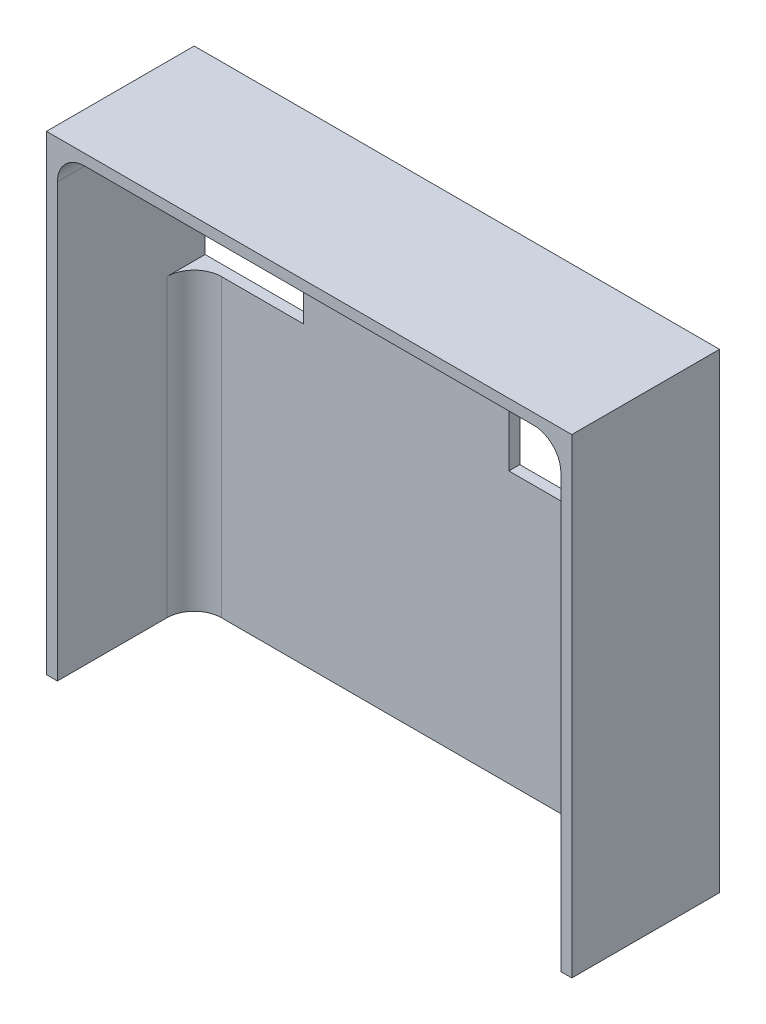
ISO-10303-21;
HEADER;
FILE_DESCRIPTION(('STEP AP214'),'2;1');
FILE_NAME('part.step','',(''),(''),'','','');
FILE_SCHEMA(('AUTOMOTIVE_DESIGN { 1 0 10303 214 1 1 1 1 }'));
ENDSEC;
DATA;
#1=APPLICATION_CONTEXT('core data for automotive mechanical design processes');
#2=APPLICATION_PROTOCOL_DEFINITION('international standard','automotive_design',2000,#1);
#3=PRODUCT_CONTEXT('',#1,'mechanical');
#4=PRODUCT('Part','Part','',(#3));
#5=PRODUCT_RELATED_PRODUCT_CATEGORY('part','',(#4));
#6=PRODUCT_DEFINITION_FORMATION('','',#4);
#7=PRODUCT_DEFINITION_CONTEXT('part definition',#1,'design');
#8=PRODUCT_DEFINITION('design','',#6,#7);
#9=PRODUCT_DEFINITION_SHAPE('','',#8);
#10=(LENGTH_UNIT() NAMED_UNIT(*) SI_UNIT(.MILLI.,.METRE.));
#11=(NAMED_UNIT(*) PLANE_ANGLE_UNIT() SI_UNIT($,.RADIAN.));
#12=(NAMED_UNIT(*) SI_UNIT($,.STERADIAN.) SOLID_ANGLE_UNIT());
#13=UNCERTAINTY_MEASURE_WITH_UNIT(LENGTH_MEASURE(1.E-05),#10,'distance_accuracy_value','');
#14=(GEOMETRIC_REPRESENTATION_CONTEXT(3) GLOBAL_UNCERTAINTY_ASSIGNED_CONTEXT((#13)) GLOBAL_UNIT_ASSIGNED_CONTEXT((#10,
#11,#12)) REPRESENTATION_CONTEXT('',''));
#15=CARTESIAN_POINT('',(0.,0.,0.));
#16=DIRECTION('',(0.,0.,1.));
#17=DIRECTION('',(1.,0.,0.));
#18=AXIS2_PLACEMENT_3D('',#15,#16,#17);
#19=CARTESIAN_POINT('',(0.,0.,2.));
#20=DIRECTION('',(0.,0.,1.));
#21=DIRECTION('',(1.,0.,0.));
#22=AXIS2_PLACEMENT_3D('',#19,#20,#21);
#23=PLANE('',#22);
#24=DIRECTION('',(1.,0.,0.));
#25=VECTOR('',#24,1.);
#26=CARTESIAN_POINT('',(0.,104.499999999999,2.));
#27=LINE('',#26,#25);
#28=CARTESIAN_POINT('',(-319.499999999999,104.499999999999,2.));
#29=VERTEX_POINT('',#28);
#30=CARTESIAN_POINT('',(-306.499999999999,104.499999999999,2.));
#31=VERTEX_POINT('',#30);
#32=EDGE_CURVE('E234',#29,#31,#27,.T.);
#33=ORIENTED_EDGE('',*,*,#32,.F.);
#34=DIRECTION('',(0.,1.,0.));
#35=VECTOR('',#34,1.);
#36=CARTESIAN_POINT('',(-319.499999999999,0.,2.));
#37=LINE('',#36,#35);
#38=CARTESIAN_POINT('',(-319.499999999999,117.499999999999,2.));
#39=VERTEX_POINT('',#38);
#40=EDGE_CURVE('E227',#29,#39,#37,.T.);
#41=ORIENTED_EDGE('',*,*,#40,.T.);
#42=DIRECTION('',(1.,0.,0.));
#43=VECTOR('',#42,1.);
#44=CARTESIAN_POINT('',(0.,117.499999999999,2.));
#45=LINE('',#44,#43);
#46=CARTESIAN_POINT('',(-306.499999999999,117.499999999999,2.));
#47=VERTEX_POINT('',#46);
#48=EDGE_CURVE('E202',#39,#47,#45,.T.);
#49=ORIENTED_EDGE('',*,*,#48,.T.);
#50=DIRECTION('',(0.,1.,0.));
#51=VECTOR('',#50,1.);
#52=CARTESIAN_POINT('',(-306.499999999999,0.,2.));
#53=LINE('',#52,#51);
#54=EDGE_CURVE('E232',#31,#47,#53,.T.);
#55=ORIENTED_EDGE('',*,*,#54,.F.);
#56=EDGE_LOOP('',(#33,#41,#49,#55));
#57=FACE_BOUND('',#56,.T.);
#58=DIRECTION('',(1.,0.,0.));
#59=VECTOR('',#58,1.);
#60=CARTESIAN_POINT('',(0.,135.999999999999,2.));
#61=LINE('',#60,#59);
#62=CARTESIAN_POINT('',(-332.999999999999,135.999999999999,2.));
#63=VERTEX_POINT('',#62);
#64=CARTESIAN_POINT('',(-318.499999999999,135.999999999999,2.));
#65=VERTEX_POINT('',#64);
#66=EDGE_CURVE('E264',#63,#65,#61,.T.);
#67=ORIENTED_EDGE('',*,*,#66,.F.);
#68=DIRECTION('',(0.,1.,0.));
#69=VECTOR('',#68,1.);
#70=CARTESIAN_POINT('',(-332.999999999999,0.,2.));
#71=LINE('',#70,#69);
#72=CARTESIAN_POINT('',(-332.999999999999,150.499999999999,2.));
#73=VERTEX_POINT('',#72);
#74=EDGE_CURVE('E250',#63,#73,#71,.T.);
#75=ORIENTED_EDGE('',*,*,#74,.T.);
#76=DIRECTION('',(1.,0.,0.));
#77=VECTOR('',#76,1.);
#78=CARTESIAN_POINT('',(0.,150.499999999999,2.));
#79=LINE('',#78,#77);
#80=CARTESIAN_POINT('',(-318.499999999999,150.499999999999,2.));
#81=VERTEX_POINT('',#80);
#82=EDGE_CURVE('E259',#73,#81,#79,.T.);
#83=ORIENTED_EDGE('',*,*,#82,.T.);
#84=DIRECTION('',(0.,1.,0.));
#85=VECTOR('',#84,1.);
#86=CARTESIAN_POINT('',(-318.499999999999,0.,2.));
#87=LINE('',#86,#85);
#88=EDGE_CURVE('E262',#65,#81,#87,.T.);
#89=ORIENTED_EDGE('',*,*,#88,.F.);
#90=EDGE_LOOP('',(#67,#75,#83,#89));
#91=FACE_BOUND('',#90,.T.);
#92=DIRECTION('',(1.,0.,0.));
#93=VECTOR('',#92,1.);
#94=CARTESIAN_POINT('',(0.,140.499999999999,2.));
#95=LINE('',#94,#93);
#96=CARTESIAN_POINT('',(-385.499999999999,140.499999999999,2.));
#97=VERTEX_POINT('',#96);
#98=CARTESIAN_POINT('',(-370.499999999999,140.499999999999,2.));
#99=VERTEX_POINT('',#98);
#100=EDGE_CURVE('E280',#97,#99,#95,.T.);
#101=ORIENTED_EDGE('',*,*,#100,.F.);
#102=DIRECTION('',(0.,-1.,0.));
#103=VECTOR('',#102,1.);
#104=CARTESIAN_POINT('',(-385.499999999999,86.4999999999994,2.));
#105=LINE('',#104,#103);
#106=CARTESIAN_POINT('',(-385.499999999999,86.4999999999994,2.));
#107=VERTEX_POINT('',#106);
#108=EDGE_CURVE('E356',#97,#107,#105,.T.);
#109=ORIENTED_EDGE('',*,*,#108,.T.);
#110=DIRECTION('',(1.,0.,0.));
#111=VECTOR('',#110,1.);
#112=CARTESIAN_POINT('',(-392.499999999999,86.4999999999994,2.));
#113=LINE('',#112,#111);
#114=CARTESIAN_POINT('',(-303.499999999999,86.4999999999994,2.));
#115=VERTEX_POINT('',#114);
#116=EDGE_CURVE('E315',#107,#115,#113,.T.);
#117=ORIENTED_EDGE('',*,*,#116,.T.);
#118=DIRECTION('',(0.,-1.,0.));
#119=VECTOR('',#118,1.);
#120=CARTESIAN_POINT('',(-303.499999999999,0.,2.));
#121=LINE('',#120,#119);
#122=CARTESIAN_POINT('',(-303.499999999999,165.499999999999,2.));
#123=VERTEX_POINT('',#122);
#124=EDGE_CURVE('E52',#115,#123,#121,.F.);
#125=ORIENTED_EDGE('',*,*,#124,.T.);
#126=DIRECTION('',(-1.,0.,0.));
#127=VECTOR('',#126,1.);
#128=CARTESIAN_POINT('',(-370.499999999999,165.499999999999,2.));
#129=LINE('',#128,#127);
#130=CARTESIAN_POINT('',(-370.499999999999,165.499999999999,2.));
#131=VERTEX_POINT('',#130);
#132=EDGE_CURVE('E56',#123,#131,#129,.T.);
#133=ORIENTED_EDGE('',*,*,#132,.T.);
#134=DIRECTION('',(0.,1.,0.));
#135=VECTOR('',#134,1.);
#136=CARTESIAN_POINT('',(-370.499999999999,0.,2.));
#137=LINE('',#136,#135);
#138=EDGE_CURVE('E286',#99,#131,#137,.T.);
#139=ORIENTED_EDGE('',*,*,#138,.F.);
#140=EDGE_LOOP('',(#101,#109,#117,#125,#133,#139));
#141=FACE_BOUND('',#140,.T.);
#142=ADVANCED_FACE('F35',(#57,#91,#141),#23,.T.);
#143=CARTESIAN_POINT('',(-392.499999999999,172.499999999999,2.));
#144=DIRECTION('',(1.,0.,0.));
#145=DIRECTION('',(0.,0.,-1.));
#146=AXIS2_PLACEMENT_3D('',#143,#144,#145);
#147=PLANE('',#146);
#148=DIRECTION('',(0.,-1.,0.));
#149=VECTOR('',#148,1.);
#150=CARTESIAN_POINT('',(-392.499999999999,172.499999999999,0.));
#151=LINE('',#150,#149);
#152=CARTESIAN_POINT('',(-392.499999999999,172.499999999999,0.));
#153=VERTEX_POINT('',#152);
#154=CARTESIAN_POINT('',(-392.499999999999,86.4999999999994,0.));
#155=VERTEX_POINT('',#154);
#156=EDGE_CURVE('E314',#153,#155,#151,.T.);
#157=ORIENTED_EDGE('',*,*,#156,.T.);
#158=DIRECTION('',(0.,0.,-1.));
#159=VECTOR('',#158,1.);
#160=CARTESIAN_POINT('',(-392.499999999999,86.4999999999994,2.));
#161=LINE('',#160,#159);
#162=CARTESIAN_POINT('',(-392.499999999999,86.4999999999994,27.));
#163=VERTEX_POINT('',#162);
#164=EDGE_CURVE('E334',#163,#155,#161,.T.);
#165=ORIENTED_EDGE('',*,*,#164,.F.);
#166=DIRECTION('',(0.,-1.,0.));
#167=VECTOR('',#166,1.);
#168=CARTESIAN_POINT('',(-392.499999999999,0.,27.));
#169=LINE('',#168,#167);
#170=CARTESIAN_POINT('',(-392.499999999999,172.499999999999,27.));
#171=VERTEX_POINT('',#170);
#172=EDGE_CURVE('E303',#171,#163,#169,.T.);
#173=ORIENTED_EDGE('',*,*,#172,.F.);
#174=DIRECTION('',(0.,0.,-1.));
#175=VECTOR('',#174,1.);
#176=CARTESIAN_POINT('',(-392.499999999999,172.499999999999,2.));
#177=LINE('',#176,#175);
#178=EDGE_CURVE('E317',#171,#153,#177,.T.);
#179=ORIENTED_EDGE('',*,*,#178,.T.);
#180=EDGE_LOOP('',(#157,#165,#173,#179));
#181=FACE_BOUND('',#180,.T.);
#182=ADVANCED_FACE('F390',(#181),#147,.F.);
#183=CARTESIAN_POINT('',(-392.499999999999,86.4999999999994,2.));
#184=DIRECTION('',(0.,1.,0.));
#185=DIRECTION('',(0.,0.,1.));
#186=AXIS2_PLACEMENT_3D('',#183,#184,#185);
#187=PLANE('',#186);
#188=DIRECTION('',(1.,0.,0.));
#189=VECTOR('',#188,1.);
#190=CARTESIAN_POINT('',(-392.499999999999,86.4999999999994,0.));
#191=LINE('',#190,#189);
#192=CARTESIAN_POINT('',(-296.499999999999,86.4999999999994,0.));
#193=VERTEX_POINT('',#192);
#194=EDGE_CURVE('E321',#155,#193,#191,.T.);
#195=ORIENTED_EDGE('',*,*,#194,.T.);
#196=DIRECTION('',(0.,0.,-1.));
#197=VECTOR('',#196,1.);
#198=CARTESIAN_POINT('',(-296.499999999999,86.4999999999994,2.));
#199=LINE('',#198,#197);
#200=CARTESIAN_POINT('',(-296.499999999999,86.4999999999994,27.));
#201=VERTEX_POINT('',#200);
#202=EDGE_CURVE('E331',#201,#193,#199,.T.);
#203=ORIENTED_EDGE('',*,*,#202,.F.);
#204=DIRECTION('',(1.,0.,0.));
#205=VECTOR('',#204,1.);
#206=CARTESIAN_POINT('',(0.,86.4999999999994,27.));
#207=LINE('',#206,#205);
#208=CARTESIAN_POINT('',(-298.499999999999,86.4999999999994,27.));
#209=VERTEX_POINT('',#208);
#210=EDGE_CURVE('E293',#209,#201,#207,.T.);
#211=ORIENTED_EDGE('',*,*,#210,.F.);
#212=DIRECTION('',(0.,0.,-1.));
#213=VECTOR('',#212,1.);
#214=CARTESIAN_POINT('',(-298.499999999999,86.4999999999994,27.));
#215=LINE('',#214,#213);
#216=CARTESIAN_POINT('',(-298.499999999999,86.4999999999994,7.));
#217=VERTEX_POINT('',#216);
#218=EDGE_CURVE('E311',#209,#217,#215,.T.);
#219=ORIENTED_EDGE('',*,*,#218,.T.);
#220=CARTESIAN_POINT('',(-303.499999999999,86.4999999999994,7.));
#221=DIRECTION('',(0.,1.,0.));
#222=DIRECTION('',(0.,0.,1.));
#223=AXIS2_PLACEMENT_3D('',#220,#221,#222);
#224=CIRCLE('',#223,5.);
#225=EDGE_CURVE('E11',#217,#115,#224,.T.);
#226=ORIENTED_EDGE('',*,*,#225,.T.);
#227=ORIENTED_EDGE('',*,*,#116,.F.);
#228=CARTESIAN_POINT('',(-385.499999999999,86.4999999999994,7.));
#229=DIRECTION('',(0.,1.,0.));
#230=DIRECTION('',(0.,0.,1.));
#231=AXIS2_PLACEMENT_3D('',#228,#229,#230);
#232=CIRCLE('',#231,5.);
#233=CARTESIAN_POINT('',(-390.499999999999,86.4999999999994,7.));
#234=VERTEX_POINT('',#233);
#235=EDGE_CURVE('E365',#107,#234,#232,.T.);
#236=ORIENTED_EDGE('',*,*,#235,.T.);
#237=DIRECTION('',(0.,0.,-1.));
#238=VECTOR('',#237,1.);
#239=CARTESIAN_POINT('',(-390.499999999999,86.4999999999994,27.));
#240=LINE('',#239,#238);
#241=CARTESIAN_POINT('',(-390.499999999999,86.4999999999994,27.));
#242=VERTEX_POINT('',#241);
#243=EDGE_CURVE('E308',#242,#234,#240,.T.);
#244=ORIENTED_EDGE('',*,*,#243,.F.);
#245=EDGE_CURVE('E297',#163,#242,#207,.T.);
#246=ORIENTED_EDGE('',*,*,#245,.F.);
#247=ORIENTED_EDGE('',*,*,#164,.T.);
#248=EDGE_LOOP('',(#195,#203,#211,#219,#226,#227,#236,#244,#246,#247));
#249=FACE_BOUND('',#248,.T.);
#250=ADVANCED_FACE('F404',(#249),#187,.F.);
#251=CARTESIAN_POINT('',(-296.499999999999,172.499999999999,2.));
#252=DIRECTION('',(-1.,0.,0.));
#253=DIRECTION('',(0.,0.,1.));
#254=AXIS2_PLACEMENT_3D('',#251,#252,#253);
#255=PLANE('',#254);
#256=DIRECTION('',(0.,1.,0.));
#257=VECTOR('',#256,1.);
#258=CARTESIAN_POINT('',(-296.499999999999,172.499999999999,0.));
#259=LINE('',#258,#257);
#260=CARTESIAN_POINT('',(-296.499999999999,172.499999999999,0.));
#261=VERTEX_POINT('',#260);
#262=EDGE_CURVE('E323',#193,#261,#259,.T.);
#263=ORIENTED_EDGE('',*,*,#262,.T.);
#264=DIRECTION('',(0.,0.,-1.));
#265=VECTOR('',#264,1.);
#266=CARTESIAN_POINT('',(-296.499999999999,172.499999999999,2.));
#267=LINE('',#266,#265);
#268=CARTESIAN_POINT('',(-296.499999999999,172.499999999999,27.));
#269=VERTEX_POINT('',#268);
#270=EDGE_CURVE('E328',#269,#261,#267,.T.);
#271=ORIENTED_EDGE('',*,*,#270,.F.);
#272=DIRECTION('',(0.,1.,0.));
#273=VECTOR('',#272,1.);
#274=CARTESIAN_POINT('',(-296.499999999999,0.,27.));
#275=LINE('',#274,#273);
#276=EDGE_CURVE('E296',#201,#269,#275,.T.);
#277=ORIENTED_EDGE('',*,*,#276,.F.);
#278=ORIENTED_EDGE('',*,*,#202,.T.);
#279=EDGE_LOOP('',(#263,#271,#277,#278));
#280=FACE_BOUND('',#279,.T.);
#281=ADVANCED_FACE('F422',(#280),#255,.F.);
#282=CARTESIAN_POINT('',(-392.499999999999,172.499999999999,2.));
#283=DIRECTION('',(0.,-1.,0.));
#284=DIRECTION('',(0.,0.,-1.));
#285=AXIS2_PLACEMENT_3D('',#282,#283,#284);
#286=PLANE('',#285);
#287=DIRECTION('',(-1.,0.,0.));
#288=VECTOR('',#287,1.);
#289=CARTESIAN_POINT('',(-392.499999999999,172.499999999999,0.));
#290=LINE('',#289,#288);
#291=EDGE_CURVE('E318',#261,#153,#290,.T.);
#292=ORIENTED_EDGE('',*,*,#291,.T.);
#293=ORIENTED_EDGE('',*,*,#178,.F.);
#294=DIRECTION('',(-1.,0.,0.));
#295=VECTOR('',#294,1.);
#296=CARTESIAN_POINT('',(0.,172.499999999999,27.));
#297=LINE('',#296,#295);
#298=EDGE_CURVE('E300',#269,#171,#297,.T.);
#299=ORIENTED_EDGE('',*,*,#298,.F.);
#300=ORIENTED_EDGE('',*,*,#270,.T.);
#301=EDGE_LOOP('',(#292,#293,#299,#300));
#302=FACE_BOUND('',#301,.T.);
#303=ADVANCED_FACE('F426',(#302),#286,.F.);
#304=CARTESIAN_POINT('',(0.,0.,0.));
#305=DIRECTION('',(0.,0.,1.));
#306=DIRECTION('',(1.,0.,0.));
#307=AXIS2_PLACEMENT_3D('',#304,#305,#306);
#308=PLANE('',#307);
#309=DIRECTION('',(0.,-1.,0.));
#310=VECTOR('',#309,1.);
#311=CARTESIAN_POINT('',(-319.499999999999,117.499999999999,0.));
#312=LINE('',#311,#310);
#313=CARTESIAN_POINT('',(-319.499999999999,117.499999999999,0.));
#314=VERTEX_POINT('',#313);
#315=CARTESIAN_POINT('',(-319.499999999999,104.499999999999,0.));
#316=VERTEX_POINT('',#315);
#317=EDGE_CURVE('E210',#314,#316,#312,.T.);
#318=ORIENTED_EDGE('',*,*,#317,.T.);
#319=DIRECTION('',(-1.,0.,0.));
#320=VECTOR('',#319,1.);
#321=CARTESIAN_POINT('',(-306.499999999999,104.499999999999,0.));
#322=LINE('',#321,#320);
#323=CARTESIAN_POINT('',(-306.499999999999,104.499999999999,0.));
#324=VERTEX_POINT('',#323);
#325=EDGE_CURVE('E215',#324,#316,#322,.T.);
#326=ORIENTED_EDGE('',*,*,#325,.F.);
#327=DIRECTION('',(0.,-1.,0.));
#328=VECTOR('',#327,1.);
#329=CARTESIAN_POINT('',(-306.499999999999,117.499999999999,0.));
#330=LINE('',#329,#328);
#331=CARTESIAN_POINT('',(-306.499999999999,117.499999999999,0.));
#332=VERTEX_POINT('',#331);
#333=EDGE_CURVE('E220',#332,#324,#330,.T.);
#334=ORIENTED_EDGE('',*,*,#333,.F.);
#335=DIRECTION('',(-1.,0.,0.));
#336=VECTOR('',#335,1.);
#337=CARTESIAN_POINT('',(-306.499999999999,117.499999999999,0.));
#338=LINE('',#337,#336);
#339=EDGE_CURVE('E199',#332,#314,#338,.T.);
#340=ORIENTED_EDGE('',*,*,#339,.T.);
#341=EDGE_LOOP('',(#318,#326,#334,#340));
#342=FACE_BOUND('',#341,.T.);
#343=DIRECTION('',(0.,-1.,0.));
#344=VECTOR('',#343,1.);
#345=CARTESIAN_POINT('',(-332.999999999999,150.499999999999,0.));
#346=LINE('',#345,#344);
#347=CARTESIAN_POINT('',(-332.999999999999,150.499999999999,0.));
#348=VERTEX_POINT('',#347);
#349=CARTESIAN_POINT('',(-332.999999999999,135.999999999999,0.));
#350=VERTEX_POINT('',#349);
#351=EDGE_CURVE('E238',#348,#350,#346,.T.);
#352=ORIENTED_EDGE('',*,*,#351,.T.);
#353=DIRECTION('',(-1.,0.,0.));
#354=VECTOR('',#353,1.);
#355=CARTESIAN_POINT('',(-318.499999999999,135.999999999999,0.));
#356=LINE('',#355,#354);
#357=CARTESIAN_POINT('',(-318.499999999999,135.999999999999,0.));
#358=VERTEX_POINT('',#357);
#359=EDGE_CURVE('E236',#358,#350,#356,.T.);
#360=ORIENTED_EDGE('',*,*,#359,.F.);
#361=DIRECTION('',(0.,-1.,0.));
#362=VECTOR('',#361,1.);
#363=CARTESIAN_POINT('',(-318.499999999999,150.499999999999,0.));
#364=LINE('',#363,#362);
#365=CARTESIAN_POINT('',(-318.499999999999,150.499999999999,0.));
#366=VERTEX_POINT('',#365);
#367=EDGE_CURVE('E244',#366,#358,#364,.T.);
#368=ORIENTED_EDGE('',*,*,#367,.F.);
#369=DIRECTION('',(-1.,0.,0.));
#370=VECTOR('',#369,1.);
#371=CARTESIAN_POINT('',(-318.499999999999,150.499999999999,0.));
#372=LINE('',#371,#370);
#373=EDGE_CURVE('E241',#366,#348,#372,.T.);
#374=ORIENTED_EDGE('',*,*,#373,.T.);
#375=EDGE_LOOP('',(#352,#360,#368,#374));
#376=FACE_BOUND('',#375,.T.);
#377=DIRECTION('',(1.,0.,0.));
#378=VECTOR('',#377,1.);
#379=CARTESIAN_POINT('',(-390.499999999999,170.499999999999,0.));
#380=LINE('',#379,#378);
#381=CARTESIAN_POINT('',(-385.499999999999,170.499999999999,0.));
#382=VERTEX_POINT('',#381);
#383=CARTESIAN_POINT('',(-370.499999999999,170.499999999999,0.));
#384=VERTEX_POINT('',#383);
#385=EDGE_CURVE('E269',#382,#384,#380,.T.);
#386=ORIENTED_EDGE('',*,*,#385,.F.);
#387=CARTESIAN_POINT('',(-385.499999999999,165.499999999999,0.));
#388=DIRECTION('',(0.,0.,1.));
#389=DIRECTION('',(1.,0.,0.));
#390=AXIS2_PLACEMENT_3D('',#387,#388,#389);
#391=CIRCLE('',#390,5.);
#392=CARTESIAN_POINT('',(-390.499999999999,165.499999999999,0.));
#393=VERTEX_POINT('',#392);
#394=EDGE_CURVE('E361',#382,#393,#391,.T.);
#395=ORIENTED_EDGE('',*,*,#394,.T.);
#396=DIRECTION('',(0.,1.,0.));
#397=VECTOR('',#396,1.);
#398=CARTESIAN_POINT('',(-390.499999999999,170.499999999999,0.));
#399=LINE('',#398,#397);
#400=CARTESIAN_POINT('',(-390.499999999999,140.499999999999,0.));
#401=VERTEX_POINT('',#400);
#402=EDGE_CURVE('E266',#401,#393,#399,.T.);
#403=ORIENTED_EDGE('',*,*,#402,.F.);
#404=DIRECTION('',(-1.,0.,0.));
#405=VECTOR('',#404,1.);
#406=CARTESIAN_POINT('',(-390.499999999999,140.499999999999,0.));
#407=LINE('',#406,#405);
#408=CARTESIAN_POINT('',(-370.499999999999,140.499999999999,0.));
#409=VERTEX_POINT('',#408);
#410=EDGE_CURVE('E274',#409,#401,#407,.T.);
#411=ORIENTED_EDGE('',*,*,#410,.F.);
#412=DIRECTION('',(0.,-1.,0.));
#413=VECTOR('',#412,1.);
#414=CARTESIAN_POINT('',(-370.499999999999,170.499999999999,0.));
#415=LINE('',#414,#413);
#416=EDGE_CURVE('E271',#384,#409,#415,.T.);
#417=ORIENTED_EDGE('',*,*,#416,.F.);
#418=EDGE_LOOP('',(#386,#395,#403,#411,#417));
#419=FACE_BOUND('',#418,.T.);
#420=ORIENTED_EDGE('',*,*,#156,.F.);
#421=ORIENTED_EDGE('',*,*,#291,.F.);
#422=ORIENTED_EDGE('',*,*,#262,.F.);
#423=ORIENTED_EDGE('',*,*,#194,.F.);
#424=EDGE_LOOP('',(#420,#421,#422,#423));
#425=FACE_BOUND('',#424,.T.);
#426=ADVANCED_FACE('F217',(#342,#376,#419,#425),#308,.F.);
#427=CARTESIAN_POINT('',(0.,170.499999999999,27.));
#428=DIRECTION('',(0.,-1.,0.));
#429=DIRECTION('',(0.,0.,-1.));
#430=AXIS2_PLACEMENT_3D('',#427,#428,#429);
#431=PLANE('',#430);
#432=DIRECTION('',(-1.,0.,0.));
#433=VECTOR('',#432,1.);
#434=CARTESIAN_POINT('',(0.,170.499999999999,27.));
#435=LINE('',#434,#433);
#436=CARTESIAN_POINT('',(-303.499999999999,170.499999999999,27.));
#437=VERTEX_POINT('',#436);
#438=CARTESIAN_POINT('',(-385.499999999999,170.499999999999,27.));
#439=VERTEX_POINT('',#438);
#440=EDGE_CURVE('E288',#437,#439,#435,.T.);
#441=ORIENTED_EDGE('',*,*,#440,.T.);
#442=DIRECTION('',(0.,0.,-1.));
#443=VECTOR('',#442,1.);
#444=CARTESIAN_POINT('',(-385.499999999999,170.499999999999,0.));
#445=LINE('',#444,#443);
#446=EDGE_CURVE('E346',#439,#382,#445,.T.);
#447=ORIENTED_EDGE('',*,*,#446,.T.);
#448=ORIENTED_EDGE('',*,*,#385,.T.);
#449=DIRECTION('',(0.,0.,-1.));
#450=VECTOR('',#449,1.);
#451=CARTESIAN_POINT('',(-370.499999999999,170.499999999999,25.));
#452=LINE('',#451,#450);
#453=CARTESIAN_POINT('',(-370.499999999999,170.499999999999,7.));
#454=VERTEX_POINT('',#453);
#455=EDGE_CURVE('E277',#454,#384,#452,.T.);
#456=ORIENTED_EDGE('',*,*,#455,.F.);
#457=DIRECTION('',(-1.,0.,0.));
#458=VECTOR('',#457,1.);
#459=CARTESIAN_POINT('',(-298.499999999999,170.499999999999,7.));
#460=LINE('',#459,#458);
#461=CARTESIAN_POINT('',(-303.499999999999,170.499999999999,7.));
#462=VERTEX_POINT('',#461);
#463=EDGE_CURVE('E342',#454,#462,#460,.F.);
#464=ORIENTED_EDGE('',*,*,#463,.T.);
#465=DIRECTION('',(0.,0.,-1.));
#466=VECTOR('',#465,1.);
#467=CARTESIAN_POINT('',(-303.499999999999,170.499999999999,27.));
#468=LINE('',#467,#466);
#469=EDGE_CURVE('E344',#462,#437,#468,.F.);
#470=ORIENTED_EDGE('',*,*,#469,.T.);
#471=EDGE_LOOP('',(#441,#447,#448,#456,#464,#470));
#472=FACE_BOUND('',#471,.T.);
#473=ADVANCED_FACE('F462',(#472),#431,.T.);
#474=CARTESIAN_POINT('',(-298.499999999999,0.,27.));
#475=DIRECTION('',(1.,0.,0.));
#476=DIRECTION('',(0.,0.,-1.));
#477=AXIS2_PLACEMENT_3D('',#474,#475,#476);
#478=PLANE('',#477);
#479=DIRECTION('',(0.,-1.,0.));
#480=VECTOR('',#479,1.);
#481=CARTESIAN_POINT('',(-298.499999999999,0.,27.));
#482=LINE('',#481,#480);
#483=CARTESIAN_POINT('',(-298.499999999999,165.499999999999,27.));
#484=VERTEX_POINT('',#483);
#485=EDGE_CURVE('E291',#484,#209,#482,.T.);
#486=ORIENTED_EDGE('',*,*,#485,.F.);
#487=DIRECTION('',(0.,0.,-1.));
#488=VECTOR('',#487,1.);
#489=CARTESIAN_POINT('',(-298.499999999999,165.499999999999,27.));
#490=LINE('',#489,#488);
#491=CARTESIAN_POINT('',(-298.499999999999,165.499999999999,7.));
#492=VERTEX_POINT('',#491);
#493=EDGE_CURVE('E339',#484,#492,#490,.T.);
#494=ORIENTED_EDGE('',*,*,#493,.T.);
#495=DIRECTION('',(0.,-1.,0.));
#496=VECTOR('',#495,1.);
#497=CARTESIAN_POINT('',(-298.499999999999,0.,7.));
#498=LINE('',#497,#496);
#499=EDGE_CURVE('E337',#492,#217,#498,.T.);
#500=ORIENTED_EDGE('',*,*,#499,.T.);
#501=ORIENTED_EDGE('',*,*,#218,.F.);
#502=EDGE_LOOP('',(#486,#494,#500,#501));
#503=FACE_BOUND('',#502,.T.);
#504=ADVANCED_FACE('F435',(#503),#478,.F.);
#505=CARTESIAN_POINT('',(-390.499999999999,0.,27.));
#506=DIRECTION('',(1.,0.,0.));
#507=DIRECTION('',(0.,0.,-1.));
#508=AXIS2_PLACEMENT_3D('',#505,#506,#507);
#509=PLANE('',#508);
#510=ORIENTED_EDGE('',*,*,#402,.T.);
#511=DIRECTION('',(0.,0.,-1.));
#512=VECTOR('',#511,1.);
#513=CARTESIAN_POINT('',(-390.499999999999,165.499999999999,27.));
#514=LINE('',#513,#512);
#515=CARTESIAN_POINT('',(-390.499999999999,165.499999999999,27.));
#516=VERTEX_POINT('',#515);
#517=EDGE_CURVE('E352',#393,#516,#514,.F.);
#518=ORIENTED_EDGE('',*,*,#517,.T.);
#519=DIRECTION('',(0.,-1.,0.));
#520=VECTOR('',#519,1.);
#521=CARTESIAN_POINT('',(-390.499999999999,0.,27.));
#522=LINE('',#521,#520);
#523=EDGE_CURVE('E306',#516,#242,#522,.T.);
#524=ORIENTED_EDGE('',*,*,#523,.T.);
#525=ORIENTED_EDGE('',*,*,#243,.T.);
#526=DIRECTION('',(0.,-1.,0.));
#527=VECTOR('',#526,1.);
#528=CARTESIAN_POINT('',(-390.499999999999,140.499999999999,7.));
#529=LINE('',#528,#527);
#530=CARTESIAN_POINT('',(-390.499999999999,140.499999999999,7.));
#531=VERTEX_POINT('',#530);
#532=EDGE_CURVE('E349',#234,#531,#529,.F.);
#533=ORIENTED_EDGE('',*,*,#532,.T.);
#534=DIRECTION('',(0.,0.,-1.));
#535=VECTOR('',#534,1.);
#536=CARTESIAN_POINT('',(-390.499999999999,140.499999999999,25.));
#537=LINE('',#536,#535);
#538=EDGE_CURVE('E278',#531,#401,#537,.T.);
#539=ORIENTED_EDGE('',*,*,#538,.T.);
#540=EDGE_LOOP('',(#510,#518,#524,#525,#533,#539));
#541=FACE_BOUND('',#540,.T.);
#542=ADVANCED_FACE('F407',(#541),#509,.T.);
#543=CARTESIAN_POINT('',(0.,0.,27.));
#544=DIRECTION('',(0.,0.,1.));
#545=DIRECTION('',(1.,0.,0.));
#546=AXIS2_PLACEMENT_3D('',#543,#544,#545);
#547=PLANE('',#546);
#548=ORIENTED_EDGE('',*,*,#440,.F.);
#549=CARTESIAN_POINT('',(-303.499999999999,165.499999999999,27.));
#550=DIRECTION('',(0.,0.,1.));
#551=DIRECTION('',(1.,0.,0.));
#552=AXIS2_PLACEMENT_3D('',#549,#550,#551);
#553=CIRCLE('',#552,5.);
#554=EDGE_CURVE('E359',#437,#484,#553,.F.);
#555=ORIENTED_EDGE('',*,*,#554,.T.);
#556=ORIENTED_EDGE('',*,*,#485,.T.);
#557=ORIENTED_EDGE('',*,*,#210,.T.);
#558=ORIENTED_EDGE('',*,*,#276,.T.);
#559=ORIENTED_EDGE('',*,*,#298,.T.);
#560=ORIENTED_EDGE('',*,*,#172,.T.);
#561=ORIENTED_EDGE('',*,*,#245,.T.);
#562=ORIENTED_EDGE('',*,*,#523,.F.);
#563=CARTESIAN_POINT('',(-385.499999999999,165.499999999999,27.));
#564=DIRECTION('',(0.,0.,1.));
#565=DIRECTION('',(1.,0.,0.));
#566=AXIS2_PLACEMENT_3D('',#563,#564,#565);
#567=CIRCLE('',#566,5.);
#568=EDGE_CURVE('E363',#516,#439,#567,.F.);
#569=ORIENTED_EDGE('',*,*,#568,.T.);
#570=EDGE_LOOP('',(#548,#555,#556,#557,#558,#559,#560,#561,#562,#569));
#571=FACE_BOUND('',#570,.T.);
#572=ADVANCED_FACE('F414',(#571),#547,.T.);
#573=CARTESIAN_POINT('',(-390.499999999999,140.499999999999,25.));
#574=DIRECTION('',(0.,-1.,0.));
#575=DIRECTION('',(0.,0.,-1.));
#576=AXIS2_PLACEMENT_3D('',#573,#574,#575);
#577=PLANE('',#576);
#578=ORIENTED_EDGE('',*,*,#538,.F.);
#579=CARTESIAN_POINT('',(-385.499999999999,140.499999999999,7.));
#580=DIRECTION('',(0.,-1.,0.));
#581=DIRECTION('',(0.,0.,-1.));
#582=AXIS2_PLACEMENT_3D('',#579,#580,#581);
#583=CIRCLE('',#582,5.);
#584=EDGE_CURVE('E367',#531,#97,#583,.T.);
#585=ORIENTED_EDGE('',*,*,#584,.T.);
#586=ORIENTED_EDGE('',*,*,#100,.T.);
#587=DIRECTION('',(0.,0.,-1.));
#588=VECTOR('',#587,1.);
#589=CARTESIAN_POINT('',(-370.499999999999,140.499999999999,25.));
#590=LINE('',#589,#588);
#591=EDGE_CURVE('E281',#99,#409,#590,.T.);
#592=ORIENTED_EDGE('',*,*,#591,.T.);
#593=ORIENTED_EDGE('',*,*,#410,.T.);
#594=EDGE_LOOP('',(#578,#585,#586,#592,#593));
#595=FACE_BOUND('',#594,.T.);
#596=ADVANCED_FACE('F470',(#595),#577,.F.);
#597=CARTESIAN_POINT('',(-370.499999999999,170.499999999999,25.));
#598=DIRECTION('',(1.,0.,0.));
#599=DIRECTION('',(0.,0.,-1.));
#600=AXIS2_PLACEMENT_3D('',#597,#598,#599);
#601=PLANE('',#600);
#602=ORIENTED_EDGE('',*,*,#138,.T.);
#603=CARTESIAN_POINT('',(-370.499999999999,165.499999999999,7.));
#604=DIRECTION('',(1.,0.,0.));
#605=DIRECTION('',(0.,0.,-1.));
#606=AXIS2_PLACEMENT_3D('',#603,#604,#605);
#607=CIRCLE('',#606,5.);
#608=EDGE_CURVE('E44',#131,#454,#607,.T.);
#609=ORIENTED_EDGE('',*,*,#608,.T.);
#610=ORIENTED_EDGE('',*,*,#455,.T.);
#611=ORIENTED_EDGE('',*,*,#416,.T.);
#612=ORIENTED_EDGE('',*,*,#591,.F.);
#613=EDGE_LOOP('',(#602,#609,#610,#611,#612));
#614=FACE_BOUND('',#613,.T.);
#615=ADVANCED_FACE('F467',(#614),#601,.F.);
#616=CARTESIAN_POINT('',(-318.499999999999,135.999999999999,25.));
#617=DIRECTION('',(0.,-1.,0.));
#618=DIRECTION('',(0.,0.,-1.));
#619=AXIS2_PLACEMENT_3D('',#616,#617,#618);
#620=PLANE('',#619);
#621=ORIENTED_EDGE('',*,*,#66,.T.);
#622=DIRECTION('',(0.,0.,-1.));
#623=VECTOR('',#622,1.);
#624=CARTESIAN_POINT('',(-318.499999999999,135.999999999999,25.));
#625=LINE('',#624,#623);
#626=EDGE_CURVE('E248',#65,#358,#625,.T.);
#627=ORIENTED_EDGE('',*,*,#626,.T.);
#628=ORIENTED_EDGE('',*,*,#359,.T.);
#629=DIRECTION('',(0.,0.,-1.));
#630=VECTOR('',#629,1.);
#631=CARTESIAN_POINT('',(-332.999999999999,135.999999999999,25.));
#632=LINE('',#631,#630);
#633=EDGE_CURVE('E247',#63,#350,#632,.T.);
#634=ORIENTED_EDGE('',*,*,#633,.F.);
#635=EDGE_LOOP('',(#621,#627,#628,#634));
#636=FACE_BOUND('',#635,.T.);
#637=ADVANCED_FACE('F561',(#636),#620,.F.);
#638=CARTESIAN_POINT('',(-318.499999999999,150.499999999999,25.));
#639=DIRECTION('',(1.,0.,0.));
#640=DIRECTION('',(0.,0.,-1.));
#641=AXIS2_PLACEMENT_3D('',#638,#639,#640);
#642=PLANE('',#641);
#643=ORIENTED_EDGE('',*,*,#88,.T.);
#644=DIRECTION('',(0.,0.,-1.));
#645=VECTOR('',#644,1.);
#646=CARTESIAN_POINT('',(-318.499999999999,150.499999999999,25.));
#647=LINE('',#646,#645);
#648=EDGE_CURVE('E251',#81,#366,#647,.T.);
#649=ORIENTED_EDGE('',*,*,#648,.T.);
#650=ORIENTED_EDGE('',*,*,#367,.T.);
#651=ORIENTED_EDGE('',*,*,#626,.F.);
#652=EDGE_LOOP('',(#643,#649,#650,#651));
#653=FACE_BOUND('',#652,.T.);
#654=ADVANCED_FACE('F570',(#653),#642,.F.);
#655=CARTESIAN_POINT('',(-318.499999999999,150.499999999999,25.));
#656=DIRECTION('',(0.,-1.,0.));
#657=DIRECTION('',(0.,0.,-1.));
#658=AXIS2_PLACEMENT_3D('',#655,#656,#657);
#659=PLANE('',#658);
#660=DIRECTION('',(0.,0.,-1.));
#661=VECTOR('',#660,1.);
#662=CARTESIAN_POINT('',(-332.999999999999,150.499999999999,25.));
#663=LINE('',#662,#661);
#664=EDGE_CURVE('E253',#73,#348,#663,.T.);
#665=ORIENTED_EDGE('',*,*,#664,.T.);
#666=ORIENTED_EDGE('',*,*,#373,.F.);
#667=ORIENTED_EDGE('',*,*,#648,.F.);
#668=ORIENTED_EDGE('',*,*,#82,.F.);
#669=EDGE_LOOP('',(#665,#666,#667,#668));
#670=FACE_BOUND('',#669,.T.);
#671=ADVANCED_FACE('F577',(#670),#659,.T.);
#672=CARTESIAN_POINT('',(-332.999999999999,150.499999999999,25.));
#673=DIRECTION('',(1.,0.,0.));
#674=DIRECTION('',(0.,0.,-1.));
#675=AXIS2_PLACEMENT_3D('',#672,#673,#674);
#676=PLANE('',#675);
#677=ORIENTED_EDGE('',*,*,#633,.T.);
#678=ORIENTED_EDGE('',*,*,#351,.F.);
#679=ORIENTED_EDGE('',*,*,#664,.F.);
#680=ORIENTED_EDGE('',*,*,#74,.F.);
#681=EDGE_LOOP('',(#677,#678,#679,#680));
#682=FACE_BOUND('',#681,.T.);
#683=ADVANCED_FACE('F585',(#682),#676,.T.);
#684=CARTESIAN_POINT('',(-306.499999999999,104.499999999999,25.));
#685=DIRECTION('',(0.,-1.,0.));
#686=DIRECTION('',(0.,0.,-1.));
#687=AXIS2_PLACEMENT_3D('',#684,#685,#686);
#688=PLANE('',#687);
#689=ORIENTED_EDGE('',*,*,#32,.T.);
#690=DIRECTION('',(0.,0.,-1.));
#691=VECTOR('',#690,1.);
#692=CARTESIAN_POINT('',(-306.499999999999,104.499999999999,25.));
#693=LINE('',#692,#691);
#694=EDGE_CURVE('E225',#31,#324,#693,.T.);
#695=ORIENTED_EDGE('',*,*,#694,.T.);
#696=ORIENTED_EDGE('',*,*,#325,.T.);
#697=DIRECTION('',(0.,0.,-1.));
#698=VECTOR('',#697,1.);
#699=CARTESIAN_POINT('',(-319.499999999999,104.499999999999,25.));
#700=LINE('',#699,#698);
#701=EDGE_CURVE('E206',#29,#316,#700,.T.);
#702=ORIENTED_EDGE('',*,*,#701,.F.);
#703=EDGE_LOOP('',(#689,#695,#696,#702));
#704=FACE_BOUND('',#703,.T.);
#705=ADVANCED_FACE('F381',(#704),#688,.F.);
#706=CARTESIAN_POINT('',(-306.499999999999,117.499999999999,25.));
#707=DIRECTION('',(1.,0.,0.));
#708=DIRECTION('',(0.,0.,-1.));
#709=AXIS2_PLACEMENT_3D('',#706,#707,#708);
#710=PLANE('',#709);
#711=ORIENTED_EDGE('',*,*,#54,.T.);
#712=DIRECTION('',(0.,0.,-1.));
#713=VECTOR('',#712,1.);
#714=CARTESIAN_POINT('',(-306.499999999999,117.499999999999,25.));
#715=LINE('',#714,#713);
#716=EDGE_CURVE('E205',#47,#332,#715,.T.);
#717=ORIENTED_EDGE('',*,*,#716,.T.);
#718=ORIENTED_EDGE('',*,*,#333,.T.);
#719=ORIENTED_EDGE('',*,*,#694,.F.);
#720=EDGE_LOOP('',(#711,#717,#718,#719));
#721=FACE_BOUND('',#720,.T.);
#722=ADVANCED_FACE('F386',(#721),#710,.F.);
#723=CARTESIAN_POINT('',(-306.499999999999,117.499999999999,25.));
#724=DIRECTION('',(0.,-1.,0.));
#725=DIRECTION('',(0.,0.,-1.));
#726=AXIS2_PLACEMENT_3D('',#723,#724,#725);
#727=PLANE('',#726);
#728=DIRECTION('',(0.,0.,-1.));
#729=VECTOR('',#728,1.);
#730=CARTESIAN_POINT('',(-319.499999999999,117.499999999999,25.));
#731=LINE('',#730,#729);
#732=EDGE_CURVE('E194',#39,#314,#731,.T.);
#733=ORIENTED_EDGE('',*,*,#732,.T.);
#734=ORIENTED_EDGE('',*,*,#339,.F.);
#735=ORIENTED_EDGE('',*,*,#716,.F.);
#736=ORIENTED_EDGE('',*,*,#48,.F.);
#737=EDGE_LOOP('',(#733,#734,#735,#736));
#738=FACE_BOUND('',#737,.T.);
#739=ADVANCED_FACE('F196',(#738),#727,.T.);
#740=CARTESIAN_POINT('',(-319.499999999999,117.499999999999,25.));
#741=DIRECTION('',(1.,0.,0.));
#742=DIRECTION('',(0.,0.,-1.));
#743=AXIS2_PLACEMENT_3D('',#740,#741,#742);
#744=PLANE('',#743);
#745=ORIENTED_EDGE('',*,*,#701,.T.);
#746=ORIENTED_EDGE('',*,*,#317,.F.);
#747=ORIENTED_EDGE('',*,*,#732,.F.);
#748=ORIENTED_EDGE('',*,*,#40,.F.);
#749=EDGE_LOOP('',(#745,#746,#747,#748));
#750=FACE_BOUND('',#749,.T.);
#751=ADVANCED_FACE('F211',(#750),#744,.T.);
#752=CARTESIAN_POINT('',(-303.499999999999,0.,7.));
#753=DIRECTION('',(0.,-1.,0.));
#754=DIRECTION('',(0.,0.,-1.));
#755=AXIS2_PLACEMENT_3D('',#752,#753,#754);
#756=CYLINDRICAL_SURFACE('',#755,5.);
#757=ORIENTED_EDGE('',*,*,#225,.F.);
#758=ORIENTED_EDGE('',*,*,#499,.F.);
#759=CARTESIAN_POINT('',(-303.499999999999,165.499999999999,7.));
#760=DIRECTION('',(0.,-1.,0.));
#761=DIRECTION('',(0.,0.,-1.));
#762=AXIS2_PLACEMENT_3D('',#759,#760,#761);
#763=CIRCLE('',#762,5.);
#764=EDGE_CURVE('E39',#123,#492,#763,.T.);
#765=ORIENTED_EDGE('',*,*,#764,.F.);
#766=ORIENTED_EDGE('',*,*,#124,.F.);
#767=EDGE_LOOP('',(#757,#758,#765,#766));
#768=FACE_BOUND('',#767,.T.);
#769=ADVANCED_FACE('F433',(#768),#756,.F.);
#770=CARTESIAN_POINT('',(0.,165.499999999999,7.));
#771=DIRECTION('',(1.,0.,0.));
#772=DIRECTION('',(0.,0.,-1.));
#773=AXIS2_PLACEMENT_3D('',#770,#771,#772);
#774=CYLINDRICAL_SURFACE('',#773,5.);
#775=ORIENTED_EDGE('',*,*,#608,.F.);
#776=ORIENTED_EDGE('',*,*,#132,.F.);
#777=CARTESIAN_POINT('',(-303.499999999999,165.499999999999,7.));
#778=DIRECTION('',(-1.,0.,0.));
#779=DIRECTION('',(0.,0.,1.));
#780=AXIS2_PLACEMENT_3D('',#777,#778,#779);
#781=CIRCLE('',#780,5.);
#782=EDGE_CURVE('E372',#462,#123,#781,.T.);
#783=ORIENTED_EDGE('',*,*,#782,.F.);
#784=ORIENTED_EDGE('',*,*,#463,.F.);
#785=EDGE_LOOP('',(#775,#776,#783,#784));
#786=FACE_BOUND('',#785,.T.);
#787=ADVANCED_FACE('F442',(#786),#774,.F.);
#788=CARTESIAN_POINT('',(-303.499999999999,165.499999999999,7.));
#789=DIRECTION('',(0.,0.,1.));
#790=DIRECTION('',(1.,0.,0.));
#791=AXIS2_PLACEMENT_3D('',#788,#789,#790);
#792=SPHERICAL_SURFACE('',#791,5.);
#793=ORIENTED_EDGE('',*,*,#782,.T.);
#794=ORIENTED_EDGE('',*,*,#764,.T.);
#795=CARTESIAN_POINT('',(-303.499999999999,165.499999999999,7.));
#796=DIRECTION('',(0.,0.,1.));
#797=DIRECTION('',(0.,-1.,0.));
#798=AXIS2_PLACEMENT_3D('',#795,#796,#797);
#799=CIRCLE('',#798,5.);
#800=EDGE_CURVE('E371',#462,#492,#799,.F.);
#801=ORIENTED_EDGE('',*,*,#800,.F.);
#802=EDGE_LOOP('',(#793,#794,#801));
#803=FACE_BOUND('',#802,.T.);
#804=ADVANCED_FACE('F440',(#803),#792,.F.);
#805=CARTESIAN_POINT('',(-303.499999999999,165.499999999999,27.));
#806=DIRECTION('',(0.,0.,-1.));
#807=DIRECTION('',(-1.,0.,0.));
#808=AXIS2_PLACEMENT_3D('',#805,#806,#807);
#809=CYLINDRICAL_SURFACE('',#808,5.);
#810=ORIENTED_EDGE('',*,*,#554,.F.);
#811=ORIENTED_EDGE('',*,*,#469,.F.);
#812=ORIENTED_EDGE('',*,*,#800,.T.);
#813=ORIENTED_EDGE('',*,*,#493,.F.);
#814=EDGE_LOOP('',(#810,#811,#812,#813));
#815=FACE_BOUND('',#814,.T.);
#816=ADVANCED_FACE('F438',(#815),#809,.F.);
#817=CARTESIAN_POINT('',(-385.499999999999,165.499999999999,27.));
#818=DIRECTION('',(0.,0.,1.));
#819=DIRECTION('',(1.,0.,0.));
#820=AXIS2_PLACEMENT_3D('',#817,#818,#819);
#821=CYLINDRICAL_SURFACE('',#820,5.);
#822=ORIENTED_EDGE('',*,*,#568,.F.);
#823=ORIENTED_EDGE('',*,*,#517,.F.);
#824=ORIENTED_EDGE('',*,*,#394,.F.);
#825=ORIENTED_EDGE('',*,*,#446,.F.);
#826=EDGE_LOOP('',(#822,#823,#824,#825));
#827=FACE_BOUND('',#826,.T.);
#828=ADVANCED_FACE('F448',(#827),#821,.F.);
#829=CARTESIAN_POINT('',(-385.499999999999,0.,7.));
#830=DIRECTION('',(0.,1.,0.));
#831=DIRECTION('',(0.,0.,1.));
#832=AXIS2_PLACEMENT_3D('',#829,#830,#831);
#833=CYLINDRICAL_SURFACE('',#832,5.);
#834=ORIENTED_EDGE('',*,*,#584,.F.);
#835=ORIENTED_EDGE('',*,*,#532,.F.);
#836=ORIENTED_EDGE('',*,*,#235,.F.);
#837=ORIENTED_EDGE('',*,*,#108,.F.);
#838=EDGE_LOOP('',(#834,#835,#836,#837));
#839=FACE_BOUND('',#838,.T.);
#840=ADVANCED_FACE('F37',(#839),#833,.F.);
#841=CLOSED_SHELL('',(#142,#182,#250,#281,#303,#426,#473,#504,#542,#572,#596,#615,#637,#654,
#671,#683,#705,#722,#739,#751,#769,#787,#804,#816,#828,#840));
#842=MANIFOLD_SOLID_BREP('B2',#841);
#843=ADVANCED_BREP_SHAPE_REPRESENTATION('',(#18,#842),#14);
#844=SHAPE_DEFINITION_REPRESENTATION(#9,#843);
ENDSEC;
END-ISO-10303-21;
